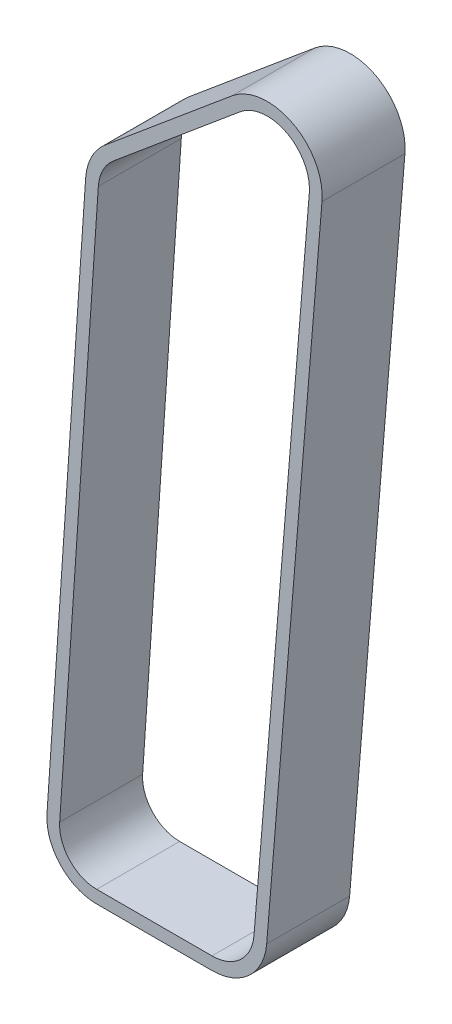
ISO-10303-21;
HEADER;
FILE_DESCRIPTION(('STEP AP214'),'2;1');
FILE_NAME('part.step','',(''),(''),'','','');
FILE_SCHEMA(('AUTOMOTIVE_DESIGN { 1 0 10303 214 1 1 1 1 }'));
ENDSEC;
DATA;
#1=APPLICATION_CONTEXT('core data for automotive mechanical design processes');
#2=APPLICATION_PROTOCOL_DEFINITION('international standard','automotive_design',2000,#1);
#3=PRODUCT_CONTEXT('',#1,'mechanical');
#4=PRODUCT('Part','Part','',(#3));
#5=PRODUCT_RELATED_PRODUCT_CATEGORY('part','',(#4));
#6=PRODUCT_DEFINITION_FORMATION('','',#4);
#7=PRODUCT_DEFINITION_CONTEXT('part definition',#1,'design');
#8=PRODUCT_DEFINITION('design','',#6,#7);
#9=PRODUCT_DEFINITION_SHAPE('','',#8);
#10=(LENGTH_UNIT() NAMED_UNIT(*) SI_UNIT(.MILLI.,.METRE.));
#11=(NAMED_UNIT(*) PLANE_ANGLE_UNIT() SI_UNIT($,.RADIAN.));
#12=(NAMED_UNIT(*) SI_UNIT($,.STERADIAN.) SOLID_ANGLE_UNIT());
#13=UNCERTAINTY_MEASURE_WITH_UNIT(LENGTH_MEASURE(1.E-05),#10,'distance_accuracy_value','');
#14=(GEOMETRIC_REPRESENTATION_CONTEXT(3) GLOBAL_UNCERTAINTY_ASSIGNED_CONTEXT((#13)) GLOBAL_UNIT_ASSIGNED_CONTEXT((#10,
#11,#12)) REPRESENTATION_CONTEXT('',''));
#15=CARTESIAN_POINT('',(0.,0.,0.));
#16=DIRECTION('',(0.,0.,1.));
#17=DIRECTION('',(1.,0.,0.));
#18=AXIS2_PLACEMENT_3D('',#15,#16,#17);
#19=CARTESIAN_POINT('',(17.0566896246943,83.,9.));
#20=DIRECTION('',(0.,0.,-1.));
#21=DIRECTION('',(-1.,0.,0.));
#22=AXIS2_PLACEMENT_3D('',#19,#20,#21);
#23=CYLINDRICAL_SURFACE('',#22,4.57799999999999);
#24=CARTESIAN_POINT('',(17.0566896246943,83.,0.));
#25=DIRECTION('',(0.,0.,1.));
#26=DIRECTION('',(1.,0.,0.));
#27=AXIS2_PLACEMENT_3D('',#24,#25,#26);
#28=CIRCLE('',#27,4.57799999999999);
#29=CARTESIAN_POINT('',(21.6191971377262,82.6236900299922,0.));
#30=VERTEX_POINT('',#29);
#31=CARTESIAN_POINT('',(14.1206537187267,86.5125172111848,0.));
#32=VERTEX_POINT('',#31);
#33=EDGE_CURVE('E206',#30,#32,#28,.T.);
#34=ORIENTED_EDGE('',*,*,#33,.F.);
#35=DIRECTION('',(0.,0.,-1.));
#36=VECTOR('',#35,1.);
#37=CARTESIAN_POINT('',(21.6191971377262,82.6236900299922,9.));
#38=LINE('',#37,#36);
#39=CARTESIAN_POINT('',(21.6191971377262,82.6236900299922,9.));
#40=VERTEX_POINT('',#39);
#41=EDGE_CURVE('E11',#40,#30,#38,.T.);
#42=ORIENTED_EDGE('',*,*,#41,.F.);
#43=CARTESIAN_POINT('',(17.0566896246943,83.,9.));
#44=DIRECTION('',(0.,0.,1.));
#45=DIRECTION('',(1.,0.,0.));
#46=AXIS2_PLACEMENT_3D('',#43,#44,#45);
#47=CIRCLE('',#46,4.57799999999999);
#48=CARTESIAN_POINT('',(14.1206537187267,86.5125172111848,9.));
#49=VERTEX_POINT('',#48);
#50=EDGE_CURVE('E291',#40,#49,#47,.T.);
#51=ORIENTED_EDGE('',*,*,#50,.T.);
#52=DIRECTION('',(0.,0.,-1.));
#53=VECTOR('',#52,1.);
#54=CARTESIAN_POINT('',(14.1206537187267,86.5125172111848,9.));
#55=LINE('',#54,#53);
#56=EDGE_CURVE('E58',#49,#32,#55,.T.);
#57=ORIENTED_EDGE('',*,*,#56,.T.);
#58=EDGE_LOOP('',(#34,#42,#51,#57));
#59=FACE_BOUND('',#58,.T.);
#60=ADVANCED_FACE('F39',(#59),#23,.F.);
#61=CARTESIAN_POINT('',(14.7044667411241,-1.21280620854404,9.));
#62=DIRECTION('',(-0.996615883143713,0.0821996439510388,0.));
#63=DIRECTION('',(-0.0821996439510388,-0.996615883143713,0.));
#64=AXIS2_PLACEMENT_3D('',#61,#62,#63);
#65=PLANE('',#64);
#66=DIRECTION('',(0.0821996439510388,0.996615883143713,0.));
#67=VECTOR('',#66,1.);
#68=CARTESIAN_POINT('',(14.7044667411241,-1.21280620854404,0.));
#69=LINE('',#68,#67);
#70=CARTESIAN_POINT('',(15.6191971377262,9.87769002999214,0.));
#71=VERTEX_POINT('',#70);
#72=EDGE_CURVE('E208',#71,#30,#69,.T.);
#73=ORIENTED_EDGE('',*,*,#72,.F.);
#74=DIRECTION('',(0.,0.,-1.));
#75=VECTOR('',#74,1.);
#76=CARTESIAN_POINT('',(15.6191971377262,9.87769002999214,9.));
#77=LINE('',#76,#75);
#78=CARTESIAN_POINT('',(15.6191971377262,9.87769002999214,9.));
#79=VERTEX_POINT('',#78);
#80=EDGE_CURVE('E49',#79,#71,#77,.T.);
#81=ORIENTED_EDGE('',*,*,#80,.F.);
#82=DIRECTION('',(0.0821996439510388,0.996615883143713,0.));
#83=VECTOR('',#82,1.);
#84=CARTESIAN_POINT('',(14.7044667411241,-1.21280620854404,9.));
#85=LINE('',#84,#83);
#86=EDGE_CURVE('E293',#79,#40,#85,.T.);
#87=ORIENTED_EDGE('',*,*,#86,.T.);
#88=ORIENTED_EDGE('',*,*,#41,.T.);
#89=EDGE_LOOP('',(#73,#81,#87,#88));
#90=FACE_BOUND('',#89,.T.);
#91=ADVANCED_FACE('F320',(#90),#65,.T.);
#92=CARTESIAN_POINT('',(11.0566896246943,10.254,9.));
#93=DIRECTION('',(0.,0.,-1.));
#94=DIRECTION('',(-1.,0.,0.));
#95=AXIS2_PLACEMENT_3D('',#92,#93,#94);
#96=CYLINDRICAL_SURFACE('',#95,4.578);
#97=CARTESIAN_POINT('',(11.0566896246943,10.254,0.));
#98=DIRECTION('',(0.,0.,1.));
#99=DIRECTION('',(1.,0.,0.));
#100=AXIS2_PLACEMENT_3D('',#97,#98,#99);
#101=CIRCLE('',#100,4.578);
#102=CARTESIAN_POINT('',(11.0566896246943,5.676,0.));
#103=VERTEX_POINT('',#102);
#104=EDGE_CURVE('E211',#103,#71,#101,.T.);
#105=ORIENTED_EDGE('',*,*,#104,.F.);
#106=DIRECTION('',(0.,0.,-1.));
#107=VECTOR('',#106,1.);
#108=CARTESIAN_POINT('',(11.0566896246943,5.676,9.));
#109=LINE('',#108,#107);
#110=CARTESIAN_POINT('',(11.0566896246943,5.676,9.));
#111=VERTEX_POINT('',#110);
#112=EDGE_CURVE('E232',#111,#103,#109,.T.);
#113=ORIENTED_EDGE('',*,*,#112,.F.);
#114=CARTESIAN_POINT('',(11.0566896246943,10.254,9.));
#115=DIRECTION('',(0.,0.,1.));
#116=DIRECTION('',(1.,0.,0.));
#117=AXIS2_PLACEMENT_3D('',#114,#115,#116);
#118=CIRCLE('',#117,4.578);
#119=EDGE_CURVE('E296',#111,#79,#118,.T.);
#120=ORIENTED_EDGE('',*,*,#119,.T.);
#121=ORIENTED_EDGE('',*,*,#80,.T.);
#122=EDGE_LOOP('',(#105,#113,#120,#121));
#123=FACE_BOUND('',#122,.T.);
#124=ADVANCED_FACE('F325',(#123),#96,.F.);
#125=CARTESIAN_POINT('',(0.,5.67599999999999,9.));
#126=DIRECTION('',(0.,1.,0.));
#127=DIRECTION('',(-1.,0.,0.));
#128=AXIS2_PLACEMENT_3D('',#125,#126,#127);
#129=PLANE('',#128);
#130=DIRECTION('',(1.,0.,0.));
#131=VECTOR('',#130,1.);
#132=CARTESIAN_POINT('',(0.,5.67599999999999,0.));
#133=LINE('',#132,#131);
#134=CARTESIAN_POINT('',(-1.44331037530571,5.67599999999999,0.));
#135=VERTEX_POINT('',#134);
#136=EDGE_CURVE('E214',#135,#103,#133,.T.);
#137=ORIENTED_EDGE('',*,*,#136,.F.);
#138=DIRECTION('',(0.,0.,-1.));
#139=VECTOR('',#138,1.);
#140=CARTESIAN_POINT('',(-1.44331037530571,5.67599999999999,9.));
#141=LINE('',#140,#139);
#142=CARTESIAN_POINT('',(-1.44331037530571,5.67599999999999,9.));
#143=VERTEX_POINT('',#142);
#144=EDGE_CURVE('E230',#143,#135,#141,.T.);
#145=ORIENTED_EDGE('',*,*,#144,.F.);
#146=DIRECTION('',(1.,0.,0.));
#147=VECTOR('',#146,1.);
#148=CARTESIAN_POINT('',(0.,5.67599999999999,9.));
#149=LINE('',#148,#147);
#150=EDGE_CURVE('E299',#143,#111,#149,.T.);
#151=ORIENTED_EDGE('',*,*,#150,.T.);
#152=ORIENTED_EDGE('',*,*,#112,.T.);
#153=EDGE_LOOP('',(#137,#145,#151,#152));
#154=FACE_BOUND('',#153,.T.);
#155=ADVANCED_FACE('F358',(#154),#129,.T.);
#156=CARTESIAN_POINT('',(-1.44331037530571,9.705,9.));
#157=DIRECTION('',(0.,0.,-1.));
#158=DIRECTION('',(-1.,0.,0.));
#159=AXIS2_PLACEMENT_3D('',#156,#157,#158);
#160=CYLINDRICAL_SURFACE('',#159,4.029);
#161=CARTESIAN_POINT('',(-1.44331037530571,9.705,0.));
#162=DIRECTION('',(0.,0.,1.));
#163=DIRECTION('',(1.,0.,0.));
#164=AXIS2_PLACEMENT_3D('',#161,#162,#163);
#165=CIRCLE('',#164,4.029);
#166=CARTESIAN_POINT('',(-5.46307284786455,9.97767318204715,0.));
#167=VERTEX_POINT('',#166);
#168=EDGE_CURVE('E217',#167,#135,#165,.T.);
#169=ORIENTED_EDGE('',*,*,#168,.F.);
#170=DIRECTION('',(0.,0.,-1.));
#171=VECTOR('',#170,1.);
#172=CARTESIAN_POINT('',(-5.46307284786455,9.97767318204715,9.));
#173=LINE('',#172,#171);
#174=CARTESIAN_POINT('',(-5.46307284786455,9.97767318204715,9.));
#175=VERTEX_POINT('',#174);
#176=EDGE_CURVE('E169',#175,#167,#173,.T.);
#177=ORIENTED_EDGE('',*,*,#176,.F.);
#178=CARTESIAN_POINT('',(-1.44331037530571,9.705,9.));
#179=DIRECTION('',(0.,0.,1.));
#180=DIRECTION('',(1.,0.,0.));
#181=AXIS2_PLACEMENT_3D('',#178,#179,#180);
#182=CIRCLE('',#181,4.029);
#183=EDGE_CURVE('E180',#175,#143,#182,.T.);
#184=ORIENTED_EDGE('',*,*,#183,.T.);
#185=ORIENTED_EDGE('',*,*,#144,.T.);
#186=EDGE_LOOP('',(#169,#177,#184,#185));
#187=FACE_BOUND('',#186,.T.);
#188=ADVANCED_FACE('F303',(#187),#160,.F.);
#189=CARTESIAN_POINT('',(-6.11176762282017,0.414580497485598,9.));
#190=DIRECTION('',(0.99770724064503,-0.0676776326749048,0.));
#191=DIRECTION('',(0.0676776326749048,0.99770724064503,0.));
#192=AXIS2_PLACEMENT_3D('',#189,#190,#191);
#193=PLANE('',#192);
#194=DIRECTION('',(-0.0676776326749048,-0.99770724064503,0.));
#195=VECTOR('',#194,1.);
#196=CARTESIAN_POINT('',(-6.11176762282017,0.414580497485598,0.));
#197=LINE('',#196,#195);
#198=CARTESIAN_POINT('',(-1.26880252036967,71.8098282023857,0.));
#199=VERTEX_POINT('',#198);
#200=EDGE_CURVE('E165',#199,#167,#197,.T.);
#201=ORIENTED_EDGE('',*,*,#200,.F.);
#202=DIRECTION('',(0.,0.,-1.));
#203=VECTOR('',#202,1.);
#204=CARTESIAN_POINT('',(-1.26880252036967,71.8098282023857,9.));
#205=LINE('',#204,#203);
#206=CARTESIAN_POINT('',(-1.26880252036967,71.8098282023857,9.));
#207=VERTEX_POINT('',#206);
#208=EDGE_CURVE('E160',#207,#199,#205,.T.);
#209=ORIENTED_EDGE('',*,*,#208,.F.);
#210=DIRECTION('',(-0.0676776326749048,-0.99770724064503,0.));
#211=VECTOR('',#210,1.);
#212=CARTESIAN_POINT('',(-6.11176762282017,0.414580497485598,9.));
#213=LINE('',#212,#211);
#214=EDGE_CURVE('E163',#207,#175,#213,.T.);
#215=ORIENTED_EDGE('',*,*,#214,.T.);
#216=ORIENTED_EDGE('',*,*,#176,.T.);
#217=EDGE_LOOP('',(#201,#209,#215,#216));
#218=FACE_BOUND('',#217,.T.);
#219=ADVANCED_FACE('F162',(#218),#193,.T.);
#220=CARTESIAN_POINT('',(3.29870122730328,71.5,9.));
#221=DIRECTION('',(0.,0.,-1.));
#222=DIRECTION('',(-1.,0.,0.));
#223=AXIS2_PLACEMENT_3D('',#220,#221,#222);
#224=CYLINDRICAL_SURFACE('',#223,4.578);
#225=CARTESIAN_POINT('',(3.29870122730328,71.5,0.));
#226=DIRECTION('',(0.,0.,1.));
#227=DIRECTION('',(1.,0.,0.));
#228=AXIS2_PLACEMENT_3D('',#225,#226,#227);
#229=CIRCLE('',#228,4.578);
#230=CARTESIAN_POINT('',(0.362665321335727,75.0125172111848,0.));
#231=VERTEX_POINT('',#230);
#232=EDGE_CURVE('E221',#231,#199,#229,.T.);
#233=ORIENTED_EDGE('',*,*,#232,.F.);
#234=DIRECTION('',(0.,0.,-1.));
#235=VECTOR('',#234,1.);
#236=CARTESIAN_POINT('',(0.362665321335727,75.0125172111848,9.));
#237=LINE('',#236,#235);
#238=CARTESIAN_POINT('',(0.362665321335727,75.0125172111848,9.));
#239=VERTEX_POINT('',#238);
#240=EDGE_CURVE('E107',#239,#231,#237,.T.);
#241=ORIENTED_EDGE('',*,*,#240,.F.);
#242=CARTESIAN_POINT('',(3.29870122730328,71.5,9.));
#243=DIRECTION('',(0.,0.,1.));
#244=DIRECTION('',(1.,0.,0.));
#245=AXIS2_PLACEMENT_3D('',#242,#243,#244);
#246=CIRCLE('',#245,4.578);
#247=EDGE_CURVE('E177',#239,#207,#246,.T.);
#248=ORIENTED_EDGE('',*,*,#247,.T.);
#249=ORIENTED_EDGE('',*,*,#208,.T.);
#250=EDGE_LOOP('',(#233,#241,#248,#249));
#251=FACE_BOUND('',#250,.T.);
#252=ADVANCED_FACE('F182',(#251),#224,.F.);
#253=CARTESIAN_POINT('',(16.0797966598624,-1.32624171719647,9.));
#254=DIRECTION('',(-0.996615883143713,0.0821996439510388,0.));
#255=DIRECTION('',(-0.0821996439510388,-0.996615883143713,0.));
#256=AXIS2_PLACEMENT_3D('',#253,#254,#255);
#257=PLANE('',#256);
#258=DIRECTION('',(0.0821996439510388,0.996615883143713,0.));
#259=VECTOR('',#258,1.);
#260=CARTESIAN_POINT('',(16.0797966598624,-1.32624171719647,0.));
#261=LINE('',#260,#259);
#262=CARTESIAN_POINT('',(16.9945270564645,9.76425452133971,0.));
#263=VERTEX_POINT('',#262);
#264=CARTESIAN_POINT('',(22.9945270564645,82.5102545213397,0.));
#265=VERTEX_POINT('',#264);
#266=EDGE_CURVE('E189',#263,#265,#261,.T.);
#267=ORIENTED_EDGE('',*,*,#266,.T.);
#268=DIRECTION('',(0.,0.,-1.));
#269=VECTOR('',#268,1.);
#270=CARTESIAN_POINT('',(22.9945270564645,82.5102545213397,9.));
#271=LINE('',#270,#269);
#272=CARTESIAN_POINT('',(22.9945270564645,82.5102545213397,9.));
#273=VERTEX_POINT('',#272);
#274=EDGE_CURVE('E43',#273,#265,#271,.T.);
#275=ORIENTED_EDGE('',*,*,#274,.F.);
#276=DIRECTION('',(0.0821996439510388,0.996615883143713,0.));
#277=VECTOR('',#276,1.);
#278=CARTESIAN_POINT('',(16.0797966598624,-1.32624171719647,9.));
#279=LINE('',#278,#277);
#280=CARTESIAN_POINT('',(16.9945270564645,9.76425452133971,9.));
#281=VERTEX_POINT('',#280);
#282=EDGE_CURVE('E226',#281,#273,#279,.T.);
#283=ORIENTED_EDGE('',*,*,#282,.F.);
#284=DIRECTION('',(0.,0.,-1.));
#285=VECTOR('',#284,1.);
#286=CARTESIAN_POINT('',(16.9945270564645,9.76425452133971,9.));
#287=LINE('',#286,#285);
#288=EDGE_CURVE('E185',#281,#263,#287,.T.);
#289=ORIENTED_EDGE('',*,*,#288,.T.);
#290=EDGE_LOOP('',(#267,#275,#283,#289));
#291=FACE_BOUND('',#290,.T.);
#292=ADVANCED_FACE('F41',(#291),#257,.F.);
#293=CARTESIAN_POINT('',(17.0566896246943,83.,9.));
#294=DIRECTION('',(0.,0.,-1.));
#295=DIRECTION('',(-1.,0.,0.));
#296=AXIS2_PLACEMENT_3D('',#293,#294,#295);
#297=CYLINDRICAL_SURFACE('',#296,5.95799999999999);
#298=CARTESIAN_POINT('',(17.0566896246943,83.,0.));
#299=DIRECTION('',(0.,0.,1.));
#300=DIRECTION('',(1.,0.,0.));
#301=AXIS2_PLACEMENT_3D('',#298,#299,#300);
#302=CIRCLE('',#301,5.95799999999999);
#303=CARTESIAN_POINT('',(13.2356101297719,87.5713362918827,0.));
#304=VERTEX_POINT('',#303);
#305=EDGE_CURVE('E192',#265,#304,#302,.T.);
#306=ORIENTED_EDGE('',*,*,#305,.T.);
#307=DIRECTION('',(0.,0.,-1.));
#308=VECTOR('',#307,1.);
#309=CARTESIAN_POINT('',(13.2356101297719,87.5713362918827,9.));
#310=LINE('',#309,#308);
#311=CARTESIAN_POINT('',(13.2356101297719,87.5713362918827,9.));
#312=VERTEX_POINT('',#311);
#313=EDGE_CURVE('E251',#312,#304,#310,.T.);
#314=ORIENTED_EDGE('',*,*,#313,.F.);
#315=CARTESIAN_POINT('',(17.0566896246943,83.,9.));
#316=DIRECTION('',(0.,0.,1.));
#317=DIRECTION('',(1.,0.,0.));
#318=AXIS2_PLACEMENT_3D('',#315,#316,#317);
#319=CIRCLE('',#318,5.95799999999999);
#320=EDGE_CURVE('E120',#273,#312,#319,.T.);
#321=ORIENTED_EDGE('',*,*,#320,.F.);
#322=ORIENTED_EDGE('',*,*,#274,.T.);
#323=EDGE_LOOP('',(#306,#314,#321,#322));
#324=FACE_BOUND('',#323,.T.);
#325=ADVANCED_FACE('F257',(#324),#297,.T.);
#326=CARTESIAN_POINT('',(-37.6473998726682,45.0393470121835,9.));
#327=DIRECTION('',(0.641335934025239,-0.767260203404278,0.));
#328=DIRECTION('',(0.767260203404278,0.641335934025239,0.));
#329=AXIS2_PLACEMENT_3D('',#326,#327,#328);
#330=PLANE('',#329);
#331=DIRECTION('',(-0.767260203404278,-0.641335934025239,0.));
#332=VECTOR('',#331,1.);
#333=CARTESIAN_POINT('',(-37.6473998726682,45.0393470121835,0.));
#334=LINE('',#333,#332);
#335=CARTESIAN_POINT('',(-0.522378267619104,76.0713362918827,0.));
#336=VERTEX_POINT('',#335);
#337=EDGE_CURVE('E194',#304,#336,#334,.T.);
#338=ORIENTED_EDGE('',*,*,#337,.T.);
#339=DIRECTION('',(0.,0.,-1.));
#340=VECTOR('',#339,1.);
#341=CARTESIAN_POINT('',(-0.522378267619104,76.0713362918827,9.));
#342=LINE('',#341,#340);
#343=CARTESIAN_POINT('',(-0.522378267619104,76.0713362918827,9.));
#344=VERTEX_POINT('',#343);
#345=EDGE_CURVE('E249',#344,#336,#342,.T.);
#346=ORIENTED_EDGE('',*,*,#345,.F.);
#347=DIRECTION('',(-0.767260203404278,-0.641335934025239,0.));
#348=VECTOR('',#347,1.);
#349=CARTESIAN_POINT('',(-37.6473998726682,45.0393470121835,9.));
#350=LINE('',#349,#348);
#351=EDGE_CURVE('E279',#312,#344,#350,.T.);
#352=ORIENTED_EDGE('',*,*,#351,.F.);
#353=ORIENTED_EDGE('',*,*,#313,.T.);
#354=EDGE_LOOP('',(#338,#346,#352,#353));
#355=FACE_BOUND('',#354,.T.);
#356=ADVANCED_FACE('F270',(#355),#330,.F.);
#357=CARTESIAN_POINT('',(3.29870122730328,71.5,9.));
#358=DIRECTION('',(0.,0.,-1.));
#359=DIRECTION('',(-1.,0.,0.));
#360=AXIS2_PLACEMENT_3D('',#357,#358,#359);
#361=CYLINDRICAL_SURFACE('',#360,5.95800000000001);
#362=CARTESIAN_POINT('',(3.29870122730328,71.5,0.));
#363=DIRECTION('',(0.,0.,1.));
#364=DIRECTION('',(1.,0.,0.));
#365=AXIS2_PLACEMENT_3D('',#362,#363,#364);
#366=CIRCLE('',#365,5.95800000000001);
#367=CARTESIAN_POINT('',(-2.64563851245982,71.9032233354771,0.));
#368=VERTEX_POINT('',#367);
#369=EDGE_CURVE('E196',#336,#368,#366,.T.);
#370=ORIENTED_EDGE('',*,*,#369,.T.);
#371=DIRECTION('',(0.,0.,-1.));
#372=VECTOR('',#371,1.);
#373=CARTESIAN_POINT('',(-2.64563851245982,71.9032233354771,9.));
#374=LINE('',#373,#372);
#375=CARTESIAN_POINT('',(-2.64563851245982,71.9032233354771,9.));
#376=VERTEX_POINT('',#375);
#377=EDGE_CURVE('E246',#376,#368,#374,.T.);
#378=ORIENTED_EDGE('',*,*,#377,.F.);
#379=CARTESIAN_POINT('',(3.29870122730328,71.5,9.));
#380=DIRECTION('',(0.,0.,1.));
#381=DIRECTION('',(1.,0.,0.));
#382=AXIS2_PLACEMENT_3D('',#379,#380,#381);
#383=CIRCLE('',#382,5.95800000000001);
#384=EDGE_CURVE('E275',#344,#376,#383,.T.);
#385=ORIENTED_EDGE('',*,*,#384,.F.);
#386=ORIENTED_EDGE('',*,*,#345,.T.);
#387=EDGE_LOOP('',(#370,#378,#385,#386));
#388=FACE_BOUND('',#387,.T.);
#389=ADVANCED_FACE('F273',(#388),#361,.T.);
#390=CARTESIAN_POINT('',(-7.48860361491031,0.507975630576966,9.));
#391=DIRECTION('',(0.99770724064503,-0.0676776326749047,0.));
#392=DIRECTION('',(0.0676776326749047,0.99770724064503,0.));
#393=AXIS2_PLACEMENT_3D('',#390,#391,#392);
#394=PLANE('',#393);
#395=DIRECTION('',(-0.0676776326749047,-0.99770724064503,0.));
#396=VECTOR('',#395,1.);
#397=CARTESIAN_POINT('',(-7.48860361491031,0.507975630576966,0.));
#398=LINE('',#397,#396);
#399=CARTESIAN_POINT('',(-6.83990883995469,10.0710683151385,0.));
#400=VERTEX_POINT('',#399);
#401=EDGE_CURVE('E198',#368,#400,#398,.T.);
#402=ORIENTED_EDGE('',*,*,#401,.T.);
#403=DIRECTION('',(0.,0.,-1.));
#404=VECTOR('',#403,1.);
#405=CARTESIAN_POINT('',(-6.83990883995469,10.0710683151385,9.));
#406=LINE('',#405,#404);
#407=CARTESIAN_POINT('',(-6.83990883995469,10.0710683151385,9.));
#408=VERTEX_POINT('',#407);
#409=EDGE_CURVE('E243',#408,#400,#406,.T.);
#410=ORIENTED_EDGE('',*,*,#409,.F.);
#411=DIRECTION('',(-0.0676776326749047,-0.99770724064503,0.));
#412=VECTOR('',#411,1.);
#413=CARTESIAN_POINT('',(-7.48860361491031,0.507975630576966,9.));
#414=LINE('',#413,#412);
#415=EDGE_CURVE('E278',#376,#408,#414,.T.);
#416=ORIENTED_EDGE('',*,*,#415,.F.);
#417=ORIENTED_EDGE('',*,*,#377,.T.);
#418=EDGE_LOOP('',(#402,#410,#416,#417));
#419=FACE_BOUND('',#418,.T.);
#420=ADVANCED_FACE('F336',(#419),#394,.F.);
#421=CARTESIAN_POINT('',(-1.44331037530571,9.705,9.));
#422=DIRECTION('',(0.,0.,-1.));
#423=DIRECTION('',(-1.,0.,0.));
#424=AXIS2_PLACEMENT_3D('',#421,#422,#423);
#425=CYLINDRICAL_SURFACE('',#424,5.409);
#426=CARTESIAN_POINT('',(-1.44331037530571,9.705,0.));
#427=DIRECTION('',(0.,0.,1.));
#428=DIRECTION('',(1.,0.,0.));
#429=AXIS2_PLACEMENT_3D('',#426,#427,#428);
#430=CIRCLE('',#429,5.409);
#431=CARTESIAN_POINT('',(-1.44331037530571,4.29599999999999,0.));
#432=VERTEX_POINT('',#431);
#433=EDGE_CURVE('E200',#400,#432,#430,.T.);
#434=ORIENTED_EDGE('',*,*,#433,.T.);
#435=DIRECTION('',(0.,0.,-1.));
#436=VECTOR('',#435,1.);
#437=CARTESIAN_POINT('',(-1.44331037530571,4.29599999999999,9.));
#438=LINE('',#437,#436);
#439=CARTESIAN_POINT('',(-1.44331037530571,4.29599999999999,9.));
#440=VERTEX_POINT('',#439);
#441=EDGE_CURVE('E240',#440,#432,#438,.T.);
#442=ORIENTED_EDGE('',*,*,#441,.F.);
#443=CARTESIAN_POINT('',(-1.44331037530571,9.705,9.));
#444=DIRECTION('',(0.,0.,1.));
#445=DIRECTION('',(1.,0.,0.));
#446=AXIS2_PLACEMENT_3D('',#443,#444,#445);
#447=CIRCLE('',#446,5.409);
#448=EDGE_CURVE('E281',#408,#440,#447,.T.);
#449=ORIENTED_EDGE('',*,*,#448,.F.);
#450=ORIENTED_EDGE('',*,*,#409,.T.);
#451=EDGE_LOOP('',(#434,#442,#449,#450));
#452=FACE_BOUND('',#451,.T.);
#453=ADVANCED_FACE('F332',(#452),#425,.T.);
#454=CARTESIAN_POINT('',(0.,4.29599999999999,9.));
#455=DIRECTION('',(0.,1.,0.));
#456=DIRECTION('',(0.,0.,1.));
#457=AXIS2_PLACEMENT_3D('',#454,#455,#456);
#458=PLANE('',#457);
#459=DIRECTION('',(1.,0.,0.));
#460=VECTOR('',#459,1.);
#461=CARTESIAN_POINT('',(0.,4.29599999999999,0.));
#462=LINE('',#461,#460);
#463=CARTESIAN_POINT('',(11.0566896246943,4.29599999999999,0.));
#464=VERTEX_POINT('',#463);
#465=EDGE_CURVE('E202',#432,#464,#462,.T.);
#466=ORIENTED_EDGE('',*,*,#465,.T.);
#467=DIRECTION('',(0.,0.,-1.));
#468=VECTOR('',#467,1.);
#469=CARTESIAN_POINT('',(11.0566896246943,4.29599999999999,9.));
#470=LINE('',#469,#468);
#471=CARTESIAN_POINT('',(11.0566896246943,4.29599999999999,9.));
#472=VERTEX_POINT('',#471);
#473=EDGE_CURVE('E237',#472,#464,#470,.T.);
#474=ORIENTED_EDGE('',*,*,#473,.F.);
#475=DIRECTION('',(1.,0.,0.));
#476=VECTOR('',#475,1.);
#477=CARTESIAN_POINT('',(0.,4.29599999999999,9.));
#478=LINE('',#477,#476);
#479=EDGE_CURVE('E287',#440,#472,#478,.T.);
#480=ORIENTED_EDGE('',*,*,#479,.F.);
#481=ORIENTED_EDGE('',*,*,#441,.T.);
#482=EDGE_LOOP('',(#466,#474,#480,#481));
#483=FACE_BOUND('',#482,.T.);
#484=ADVANCED_FACE('F314',(#483),#458,.F.);
#485=CARTESIAN_POINT('',(11.0566896246943,10.254,9.));
#486=DIRECTION('',(0.,0.,-1.));
#487=DIRECTION('',(-1.,0.,0.));
#488=AXIS2_PLACEMENT_3D('',#485,#486,#487);
#489=CYLINDRICAL_SURFACE('',#488,5.958);
#490=CARTESIAN_POINT('',(11.0566896246943,10.254,0.));
#491=DIRECTION('',(0.,0.,1.));
#492=DIRECTION('',(1.,0.,0.));
#493=AXIS2_PLACEMENT_3D('',#490,#491,#492);
#494=CIRCLE('',#493,5.958);
#495=EDGE_CURVE('E204',#464,#263,#494,.T.);
#496=ORIENTED_EDGE('',*,*,#495,.T.);
#497=ORIENTED_EDGE('',*,*,#288,.F.);
#498=CARTESIAN_POINT('',(11.0566896246943,10.254,9.));
#499=DIRECTION('',(0.,0.,1.));
#500=DIRECTION('',(1.,0.,0.));
#501=AXIS2_PLACEMENT_3D('',#498,#499,#500);
#502=CIRCLE('',#501,5.958);
#503=EDGE_CURVE('E289',#472,#281,#502,.T.);
#504=ORIENTED_EDGE('',*,*,#503,.F.);
#505=ORIENTED_EDGE('',*,*,#473,.T.);
#506=EDGE_LOOP('',(#496,#497,#504,#505));
#507=FACE_BOUND('',#506,.T.);
#508=ADVANCED_FACE('F307',(#507),#489,.T.);
#509=CARTESIAN_POINT('',(-36.7623562837134,43.9805279314856,9.));
#510=DIRECTION('',(0.641335934025239,-0.767260203404278,0.));
#511=DIRECTION('',(0.767260203404278,0.641335934025239,0.));
#512=AXIS2_PLACEMENT_3D('',#509,#510,#511);
#513=PLANE('',#512);
#514=DIRECTION('',(-0.767260203404278,-0.641335934025239,0.));
#515=VECTOR('',#514,1.);
#516=CARTESIAN_POINT('',(-36.7623562837134,43.9805279314856,0.));
#517=LINE('',#516,#515);
#518=EDGE_CURVE('E223',#32,#231,#517,.T.);
#519=ORIENTED_EDGE('',*,*,#518,.F.);
#520=ORIENTED_EDGE('',*,*,#56,.F.);
#521=DIRECTION('',(-0.767260203404278,-0.641335934025239,0.));
#522=VECTOR('',#521,1.);
#523=CARTESIAN_POINT('',(-36.7623562837134,43.9805279314856,9.));
#524=LINE('',#523,#522);
#525=EDGE_CURVE('E183',#49,#239,#524,.T.);
#526=ORIENTED_EDGE('',*,*,#525,.T.);
#527=ORIENTED_EDGE('',*,*,#240,.T.);
#528=EDGE_LOOP('',(#519,#520,#526,#527));
#529=FACE_BOUND('',#528,.T.);
#530=ADVANCED_FACE('F305',(#529),#513,.T.);
#531=CARTESIAN_POINT('',(0.,0.,9.));
#532=DIRECTION('',(0.,0.,1.));
#533=DIRECTION('',(1.,0.,0.));
#534=AXIS2_PLACEMENT_3D('',#531,#532,#533);
#535=PLANE('',#534);
#536=ORIENTED_EDGE('',*,*,#282,.T.);
#537=ORIENTED_EDGE('',*,*,#320,.T.);
#538=ORIENTED_EDGE('',*,*,#351,.T.);
#539=ORIENTED_EDGE('',*,*,#384,.T.);
#540=ORIENTED_EDGE('',*,*,#415,.T.);
#541=ORIENTED_EDGE('',*,*,#448,.T.);
#542=ORIENTED_EDGE('',*,*,#479,.T.);
#543=ORIENTED_EDGE('',*,*,#503,.T.);
#544=EDGE_LOOP('',(#536,#537,#538,#539,#540,#541,#542,#543));
#545=FACE_BOUND('',#544,.T.);
#546=ORIENTED_EDGE('',*,*,#50,.F.);
#547=ORIENTED_EDGE('',*,*,#86,.F.);
#548=ORIENTED_EDGE('',*,*,#119,.F.);
#549=ORIENTED_EDGE('',*,*,#150,.F.);
#550=ORIENTED_EDGE('',*,*,#183,.F.);
#551=ORIENTED_EDGE('',*,*,#214,.F.);
#552=ORIENTED_EDGE('',*,*,#247,.F.);
#553=ORIENTED_EDGE('',*,*,#525,.F.);
#554=EDGE_LOOP('',(#546,#547,#548,#549,#550,#551,#552,#553));
#555=FACE_BOUND('',#554,.T.);
#556=ADVANCED_FACE('F175',(#545,#555),#535,.T.);
#557=CARTESIAN_POINT('',(0.,0.,0.));
#558=DIRECTION('',(0.,0.,1.));
#559=DIRECTION('',(1.,0.,0.));
#560=AXIS2_PLACEMENT_3D('',#557,#558,#559);
#561=PLANE('',#560);
#562=ORIENTED_EDGE('',*,*,#266,.F.);
#563=ORIENTED_EDGE('',*,*,#495,.F.);
#564=ORIENTED_EDGE('',*,*,#465,.F.);
#565=ORIENTED_EDGE('',*,*,#433,.F.);
#566=ORIENTED_EDGE('',*,*,#401,.F.);
#567=ORIENTED_EDGE('',*,*,#369,.F.);
#568=ORIENTED_EDGE('',*,*,#337,.F.);
#569=ORIENTED_EDGE('',*,*,#305,.F.);
#570=EDGE_LOOP('',(#562,#563,#564,#565,#566,#567,#568,#569));
#571=FACE_BOUND('',#570,.T.);
#572=ORIENTED_EDGE('',*,*,#33,.T.);
#573=ORIENTED_EDGE('',*,*,#518,.T.);
#574=ORIENTED_EDGE('',*,*,#232,.T.);
#575=ORIENTED_EDGE('',*,*,#200,.T.);
#576=ORIENTED_EDGE('',*,*,#168,.T.);
#577=ORIENTED_EDGE('',*,*,#136,.T.);
#578=ORIENTED_EDGE('',*,*,#104,.T.);
#579=ORIENTED_EDGE('',*,*,#72,.T.);
#580=EDGE_LOOP('',(#572,#573,#574,#575,#576,#577,#578,#579));
#581=FACE_BOUND('',#580,.T.);
#582=ADVANCED_FACE('F264',(#571,#581),#561,.F.);
#583=CLOSED_SHELL('',(#60,#91,#124,#155,#188,#219,#252,#292,#325,#356,#389,#420,#453,#484,#508,
#530,#556,#582));
#584=MANIFOLD_SOLID_BREP('B2',#583);
#585=ADVANCED_BREP_SHAPE_REPRESENTATION('',(#18,#584),#14);
#586=SHAPE_DEFINITION_REPRESENTATION(#9,#585);
ENDSEC;
END-ISO-10303-21;
